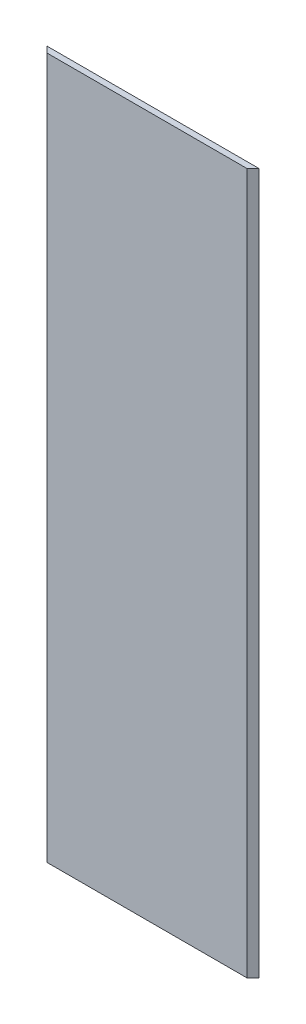
ISO-10303-21;
HEADER;
FILE_DESCRIPTION(('STEP AP214'),'2;1');
FILE_NAME('part.step','',(''),(''),'','','');
FILE_SCHEMA(('AUTOMOTIVE_DESIGN { 1 0 10303 214 1 1 1 1 }'));
ENDSEC;
DATA;
#1=APPLICATION_CONTEXT('core data for automotive mechanical design processes');
#2=APPLICATION_PROTOCOL_DEFINITION('international standard','automotive_design',2000,#1);
#3=PRODUCT_CONTEXT('',#1,'mechanical');
#4=PRODUCT('Part','Part','',(#3));
#5=PRODUCT_RELATED_PRODUCT_CATEGORY('part','',(#4));
#6=PRODUCT_DEFINITION_FORMATION('','',#4);
#7=PRODUCT_DEFINITION_CONTEXT('part definition',#1,'design');
#8=PRODUCT_DEFINITION('design','',#6,#7);
#9=PRODUCT_DEFINITION_SHAPE('','',#8);
#10=(LENGTH_UNIT() NAMED_UNIT(*) SI_UNIT(.MILLI.,.METRE.));
#11=(NAMED_UNIT(*) PLANE_ANGLE_UNIT() SI_UNIT($,.RADIAN.));
#12=(NAMED_UNIT(*) SI_UNIT($,.STERADIAN.) SOLID_ANGLE_UNIT());
#13=UNCERTAINTY_MEASURE_WITH_UNIT(LENGTH_MEASURE(1.E-05),#10,'distance_accuracy_value','');
#14=(GEOMETRIC_REPRESENTATION_CONTEXT(3) GLOBAL_UNCERTAINTY_ASSIGNED_CONTEXT((#13)) GLOBAL_UNIT_ASSIGNED_CONTEXT((#10,
#11,#12)) REPRESENTATION_CONTEXT('',''));
#15=CARTESIAN_POINT('',(0.,0.,0.));
#16=DIRECTION('',(0.,0.,1.));
#17=DIRECTION('',(1.,0.,0.));
#18=AXIS2_PLACEMENT_3D('',#15,#16,#17);
#19=CARTESIAN_POINT('',(50.,175.,3.));
#20=DIRECTION('',(0.707106781186554,0.,0.707106781186541));
#21=DIRECTION('',(0.707106781186541,0.,-0.707106781186554));
#22=AXIS2_PLACEMENT_3D('',#19,#20,#21);
#23=PLANE('',#22);
#24=DIRECTION('',(-0.707106781186541,0.,0.707106781186554));
#25=VECTOR('',#24,1.);
#26=CARTESIAN_POINT('',(50.,-175.,3.));
#27=LINE('',#26,#25);
#28=CARTESIAN_POINT('',(53.,-175.,0.));
#29=VERTEX_POINT('',#28);
#30=CARTESIAN_POINT('',(50.,-175.,3.));
#31=VERTEX_POINT('',#30);
#32=EDGE_CURVE('E98',#29,#31,#27,.T.);
#33=ORIENTED_EDGE('',*,*,#32,.F.);
#34=DIRECTION('',(0.,-1.,0.));
#35=VECTOR('',#34,1.);
#36=CARTESIAN_POINT('',(53.,175.,0.));
#37=LINE('',#36,#35);
#38=CARTESIAN_POINT('',(53.,175.,0.));
#39=VERTEX_POINT('',#38);
#40=EDGE_CURVE('E101',#39,#29,#37,.T.);
#41=ORIENTED_EDGE('',*,*,#40,.F.);
#42=DIRECTION('',(-0.707106781186541,0.,0.707106781186554));
#43=VECTOR('',#42,1.);
#44=CARTESIAN_POINT('',(50.,175.,3.));
#45=LINE('',#44,#43);
#46=CARTESIAN_POINT('',(50.,175.,3.));
#47=VERTEX_POINT('',#46);
#48=EDGE_CURVE('E82',#39,#47,#45,.T.);
#49=ORIENTED_EDGE('',*,*,#48,.T.);
#50=DIRECTION('',(0.,1.,0.));
#51=VECTOR('',#50,1.);
#52=CARTESIAN_POINT('',(50.,-175.,3.));
#53=LINE('',#52,#51);
#54=EDGE_CURVE('E11',#31,#47,#53,.T.);
#55=ORIENTED_EDGE('',*,*,#54,.F.);
#56=EDGE_LOOP('',(#33,#41,#49,#55));
#57=FACE_BOUND('',#56,.T.);
#58=ADVANCED_FACE('F39',(#57),#23,.T.);
#59=CARTESIAN_POINT('',(50.,175.,3.));
#60=DIRECTION('',(0.,-1.,0.));
#61=DIRECTION('',(0.,0.,-1.));
#62=AXIS2_PLACEMENT_3D('',#59,#60,#61);
#63=PLANE('',#62);
#64=DIRECTION('',(-1.,0.,0.));
#65=VECTOR('',#64,1.);
#66=CARTESIAN_POINT('',(50.,175.,0.));
#67=LINE('',#66,#65);
#68=CARTESIAN_POINT('',(-53.,175.,0.));
#69=VERTEX_POINT('',#68);
#70=EDGE_CURVE('E77',#39,#69,#67,.T.);
#71=ORIENTED_EDGE('',*,*,#70,.T.);
#72=DIRECTION('',(-0.707106781186541,0.,-0.707106781186554));
#73=VECTOR('',#72,1.);
#74=CARTESIAN_POINT('',(-50.,175.,3.));
#75=LINE('',#74,#73);
#76=CARTESIAN_POINT('',(-50.,175.,3.));
#77=VERTEX_POINT('',#76);
#78=EDGE_CURVE('E80',#77,#69,#75,.T.);
#79=ORIENTED_EDGE('',*,*,#78,.F.);
#80=DIRECTION('',(-1.,0.,0.));
#81=VECTOR('',#80,1.);
#82=CARTESIAN_POINT('',(50.,175.,3.));
#83=LINE('',#82,#81);
#84=EDGE_CURVE('E106',#47,#77,#83,.T.);
#85=ORIENTED_EDGE('',*,*,#84,.F.);
#86=ORIENTED_EDGE('',*,*,#48,.F.);
#87=EDGE_LOOP('',(#71,#79,#85,#86));
#88=FACE_BOUND('',#87,.T.);
#89=ADVANCED_FACE('F41',(#88),#63,.F.);
#90=CARTESIAN_POINT('',(50.,-175.,3.));
#91=DIRECTION('',(0.,1.,0.));
#92=DIRECTION('',(0.,0.,1.));
#93=AXIS2_PLACEMENT_3D('',#90,#91,#92);
#94=PLANE('',#93);
#95=DIRECTION('',(1.,0.,0.));
#96=VECTOR('',#95,1.);
#97=CARTESIAN_POINT('',(50.,-175.,0.));
#98=LINE('',#97,#96);
#99=CARTESIAN_POINT('',(-53.,-175.,0.));
#100=VERTEX_POINT('',#99);
#101=EDGE_CURVE('E43',#100,#29,#98,.T.);
#102=ORIENTED_EDGE('',*,*,#101,.T.);
#103=ORIENTED_EDGE('',*,*,#32,.T.);
#104=DIRECTION('',(1.,0.,0.));
#105=VECTOR('',#104,1.);
#106=CARTESIAN_POINT('',(50.,-175.,3.));
#107=LINE('',#106,#105);
#108=CARTESIAN_POINT('',(-50.,-175.,3.));
#109=VERTEX_POINT('',#108);
#110=EDGE_CURVE('E48',#109,#31,#107,.T.);
#111=ORIENTED_EDGE('',*,*,#110,.F.);
#112=DIRECTION('',(-0.707106781186541,0.,-0.707106781186554));
#113=VECTOR('',#112,1.);
#114=CARTESIAN_POINT('',(-50.,-175.,3.));
#115=LINE('',#114,#113);
#116=EDGE_CURVE('E96',#109,#100,#115,.T.);
#117=ORIENTED_EDGE('',*,*,#116,.T.);
#118=EDGE_LOOP('',(#102,#103,#111,#117));
#119=FACE_BOUND('',#118,.T.);
#120=ADVANCED_FACE('F111',(#119),#94,.F.);
#121=CARTESIAN_POINT('',(0.,0.,3.));
#122=DIRECTION('',(0.,0.,-1.));
#123=DIRECTION('',(-1.,0.,0.));
#124=AXIS2_PLACEMENT_3D('',#121,#122,#123);
#125=PLANE('',#124);
#126=ORIENTED_EDGE('',*,*,#84,.T.);
#127=DIRECTION('',(0.,-1.,0.));
#128=VECTOR('',#127,1.);
#129=CARTESIAN_POINT('',(-50.,-175.,3.));
#130=LINE('',#129,#128);
#131=EDGE_CURVE('E95',#77,#109,#130,.T.);
#132=ORIENTED_EDGE('',*,*,#131,.T.);
#133=ORIENTED_EDGE('',*,*,#110,.T.);
#134=ORIENTED_EDGE('',*,*,#54,.T.);
#135=EDGE_LOOP('',(#126,#132,#133,#134));
#136=FACE_BOUND('',#135,.T.);
#137=ADVANCED_FACE('F109',(#136),#125,.F.);
#138=CARTESIAN_POINT('',(0.,0.,0.));
#139=DIRECTION('',(0.,0.,-1.));
#140=DIRECTION('',(-1.,0.,0.));
#141=AXIS2_PLACEMENT_3D('',#138,#139,#140);
#142=PLANE('',#141);
#143=ORIENTED_EDGE('',*,*,#70,.F.);
#144=ORIENTED_EDGE('',*,*,#40,.T.);
#145=ORIENTED_EDGE('',*,*,#101,.F.);
#146=DIRECTION('',(0.,-1.,0.));
#147=VECTOR('',#146,1.);
#148=CARTESIAN_POINT('',(-53.,175.,0.));
#149=LINE('',#148,#147);
#150=EDGE_CURVE('E86',#69,#100,#149,.T.);
#151=ORIENTED_EDGE('',*,*,#150,.F.);
#152=EDGE_LOOP('',(#143,#144,#145,#151));
#153=FACE_BOUND('',#152,.T.);
#154=ADVANCED_FACE('F88',(#153),#142,.T.);
#155=CARTESIAN_POINT('',(-50.,175.,3.));
#156=DIRECTION('',(-0.707106781186554,0.,0.707106781186541));
#157=DIRECTION('',(0.707106781186541,0.,0.707106781186554));
#158=AXIS2_PLACEMENT_3D('',#155,#156,#157);
#159=PLANE('',#158);
#160=ORIENTED_EDGE('',*,*,#116,.F.);
#161=ORIENTED_EDGE('',*,*,#131,.F.);
#162=ORIENTED_EDGE('',*,*,#78,.T.);
#163=ORIENTED_EDGE('',*,*,#150,.T.);
#164=EDGE_LOOP('',(#160,#161,#162,#163));
#165=FACE_BOUND('',#164,.T.);
#166=ADVANCED_FACE('F94',(#165),#159,.T.);
#167=CLOSED_SHELL('',(#58,#89,#120,#137,#154,#166));
#168=MANIFOLD_SOLID_BREP('B2',#167);
#169=ADVANCED_BREP_SHAPE_REPRESENTATION('',(#18,#168),#14);
#170=SHAPE_DEFINITION_REPRESENTATION(#9,#169);
ENDSEC;
END-ISO-10303-21;
